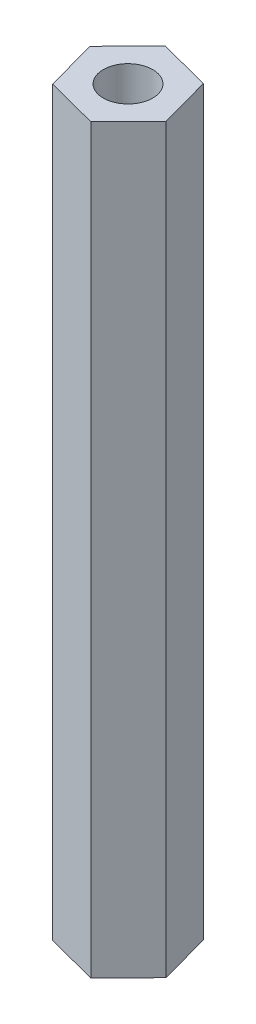
ISO-10303-21;
HEADER;
FILE_DESCRIPTION(('STEP AP214'),'2;1');
FILE_NAME('part.step','',(''),(''),'','','');
FILE_SCHEMA(('AUTOMOTIVE_DESIGN { 1 0 10303 214 1 1 1 1 }'));
ENDSEC;
DATA;
#1=APPLICATION_CONTEXT('core data for automotive mechanical design processes');
#2=APPLICATION_PROTOCOL_DEFINITION('international standard','automotive_design',2000,#1);
#3=PRODUCT_CONTEXT('',#1,'mechanical');
#4=PRODUCT('Part','Part','',(#3));
#5=PRODUCT_RELATED_PRODUCT_CATEGORY('part','',(#4));
#6=PRODUCT_DEFINITION_FORMATION('','',#4);
#7=PRODUCT_DEFINITION_CONTEXT('part definition',#1,'design');
#8=PRODUCT_DEFINITION('design','',#6,#7);
#9=PRODUCT_DEFINITION_SHAPE('','',#8);
#10=(LENGTH_UNIT() NAMED_UNIT(*) SI_UNIT(.MILLI.,.METRE.));
#11=(NAMED_UNIT(*) PLANE_ANGLE_UNIT() SI_UNIT($,.RADIAN.));
#12=(NAMED_UNIT(*) SI_UNIT($,.STERADIAN.) SOLID_ANGLE_UNIT());
#13=UNCERTAINTY_MEASURE_WITH_UNIT(LENGTH_MEASURE(1.E-05),#10,'distance_accuracy_value','');
#14=(GEOMETRIC_REPRESENTATION_CONTEXT(3) GLOBAL_UNCERTAINTY_ASSIGNED_CONTEXT((#13)) GLOBAL_UNIT_ASSIGNED_CONTEXT((#10,
#11,#12)) REPRESENTATION_CONTEXT('',''));
#15=CARTESIAN_POINT('',(0.,0.,0.));
#16=DIRECTION('',(0.,0.,1.));
#17=DIRECTION('',(1.,0.,0.));
#18=AXIS2_PLACEMENT_3D('',#15,#16,#17);
#19=CARTESIAN_POINT('',(0.,45.,0.));
#20=DIRECTION('',(0.,1.,0.));
#21=DIRECTION('',(0.,0.,1.));
#22=AXIS2_PLACEMENT_3D('',#19,#20,#21);
#23=PLANE('',#22);
#24=DIRECTION('',(0.967670500935497,0.,0.252217766264086));
#25=VECTOR('',#24,1.);
#26=CARTESIAN_POINT('',(-2.27052725330495,45.,2.30174701592786));
#27=LINE('',#26,#25);
#28=CARTESIAN_POINT('',(-2.27052725330495,45.,2.30174701592786));
#29=VERTEX_POINT('',#28);
#30=CARTESIAN_POINT('',(0.858107762226074,45.,3.11720778931092));
#31=VERTEX_POINT('',#30);
#32=EDGE_CURVE('E146',#29,#31,#27,.T.);
#33=ORIENTED_EDGE('',*,*,#32,.T.);
#34=DIRECTION('',(0.702262243338212,0.,-0.711918353170911));
#35=VECTOR('',#34,1.);
#36=CARTESIAN_POINT('',(0.858107762226074,45.,3.11720778931092));
#37=LINE('',#36,#35);
#38=CARTESIAN_POINT('',(3.12863501553103,45.,0.815460773383064));
#39=VERTEX_POINT('',#38);
#40=EDGE_CURVE('E94',#31,#39,#37,.T.);
#41=ORIENTED_EDGE('',*,*,#40,.T.);
#42=DIRECTION('',(-0.265408257597285,0.,-0.964136119434996));
#43=VECTOR('',#42,1.);
#44=CARTESIAN_POINT('',(3.12863501553103,45.,0.815460773383064));
#45=LINE('',#44,#43);
#46=CARTESIAN_POINT('',(2.27052725330495,45.,-2.30174701592786));
#47=VERTEX_POINT('',#46);
#48=EDGE_CURVE('E107',#39,#47,#45,.T.);
#49=ORIENTED_EDGE('',*,*,#48,.T.);
#50=DIRECTION('',(-0.967670500935497,0.,-0.252217766264086));
#51=VECTOR('',#50,1.);
#52=CARTESIAN_POINT('',(2.27052725330495,45.,-2.30174701592786));
#53=LINE('',#52,#51);
#54=CARTESIAN_POINT('',(-0.858107762226074,45.,-3.11720778931093));
#55=VERTEX_POINT('',#54);
#56=EDGE_CURVE('E101',#47,#55,#53,.T.);
#57=ORIENTED_EDGE('',*,*,#56,.T.);
#58=DIRECTION('',(-0.702262243338212,0.,0.711918353170911));
#59=VECTOR('',#58,1.);
#60=CARTESIAN_POINT('',(-0.858107762226074,45.,-3.11720778931093));
#61=LINE('',#60,#59);
#62=CARTESIAN_POINT('',(-3.12863501553103,45.,-0.815460773383065));
#63=VERTEX_POINT('',#62);
#64=EDGE_CURVE('E105',#55,#63,#61,.T.);
#65=ORIENTED_EDGE('',*,*,#64,.T.);
#66=DIRECTION('',(0.265408257597285,0.,0.964136119434996));
#67=VECTOR('',#66,1.);
#68=CARTESIAN_POINT('',(-3.12863501553103,45.,-0.815460773383065));
#69=LINE('',#68,#67);
#70=EDGE_CURVE('E57',#63,#29,#69,.T.);
#71=ORIENTED_EDGE('',*,*,#70,.T.);
#72=EDGE_LOOP('',(#33,#41,#49,#57,#65,#71));
#73=FACE_BOUND('',#72,.T.);
#74=CARTESIAN_POINT('',(0.,45.,0.));
#75=DIRECTION('',(0.,1.,0.));
#76=DIRECTION('',(0.,0.,1.));
#77=AXIS2_PLACEMENT_3D('',#74,#75,#76);
#78=CIRCLE('',#77,1.5);
#79=CARTESIAN_POINT('',(0.,45.,-1.5));
#80=VERTEX_POINT('',#79);
#81=EDGE_CURVE('E134',#80,#80,#78,.T.);
#82=ORIENTED_EDGE('',*,*,#81,.F.);
#83=EDGE_LOOP('',(#82));
#84=FACE_BOUND('',#83,.T.);
#85=ADVANCED_FACE('F39',(#73,#84),#23,.T.);
#86=CARTESIAN_POINT('',(0.,0.,0.));
#87=DIRECTION('',(0.,1.,0.));
#88=DIRECTION('',(0.,0.,1.));
#89=AXIS2_PLACEMENT_3D('',#86,#87,#88);
#90=PLANE('',#89);
#91=DIRECTION('',(0.967670500935497,0.,0.252217766264086));
#92=VECTOR('',#91,1.);
#93=CARTESIAN_POINT('',(-2.27052725330495,0.,2.30174701592786));
#94=LINE('',#93,#92);
#95=CARTESIAN_POINT('',(-2.27052725330495,0.,2.30174701592786));
#96=VERTEX_POINT('',#95);
#97=CARTESIAN_POINT('',(0.858107762226074,0.,3.11720778931092));
#98=VERTEX_POINT('',#97);
#99=EDGE_CURVE('E129',#96,#98,#94,.T.);
#100=ORIENTED_EDGE('',*,*,#99,.F.);
#101=DIRECTION('',(0.265408257597285,0.,0.964136119434996));
#102=VECTOR('',#101,1.);
#103=CARTESIAN_POINT('',(-3.12863501553103,0.,-0.815460773383065));
#104=LINE('',#103,#102);
#105=CARTESIAN_POINT('',(-3.12863501553103,0.,-0.815460773383065));
#106=VERTEX_POINT('',#105);
#107=EDGE_CURVE('E86',#106,#96,#104,.T.);
#108=ORIENTED_EDGE('',*,*,#107,.F.);
#109=DIRECTION('',(-0.702262243338212,0.,0.711918353170911));
#110=VECTOR('',#109,1.);
#111=CARTESIAN_POINT('',(-0.858107762226074,0.,-3.11720778931093));
#112=LINE('',#111,#110);
#113=CARTESIAN_POINT('',(-0.858107762226074,0.,-3.11720778931093));
#114=VERTEX_POINT('',#113);
#115=EDGE_CURVE('E80',#114,#106,#112,.T.);
#116=ORIENTED_EDGE('',*,*,#115,.F.);
#117=DIRECTION('',(-0.967670500935497,0.,-0.252217766264086));
#118=VECTOR('',#117,1.);
#119=CARTESIAN_POINT('',(2.27052725330495,0.,-2.30174701592786));
#120=LINE('',#119,#118);
#121=CARTESIAN_POINT('',(2.27052725330495,0.,-2.30174701592786));
#122=VERTEX_POINT('',#121);
#123=EDGE_CURVE('E116',#122,#114,#120,.T.);
#124=ORIENTED_EDGE('',*,*,#123,.F.);
#125=DIRECTION('',(-0.265408257597285,0.,-0.964136119434996));
#126=VECTOR('',#125,1.);
#127=CARTESIAN_POINT('',(3.12863501553103,0.,0.815460773383064));
#128=LINE('',#127,#126);
#129=CARTESIAN_POINT('',(3.12863501553103,0.,0.815460773383064));
#130=VERTEX_POINT('',#129);
#131=EDGE_CURVE('E137',#130,#122,#128,.T.);
#132=ORIENTED_EDGE('',*,*,#131,.F.);
#133=DIRECTION('',(0.702262243338212,0.,-0.711918353170911));
#134=VECTOR('',#133,1.);
#135=CARTESIAN_POINT('',(0.858107762226074,0.,3.11720778931092));
#136=LINE('',#135,#134);
#137=EDGE_CURVE('E133',#98,#130,#136,.T.);
#138=ORIENTED_EDGE('',*,*,#137,.F.);
#139=EDGE_LOOP('',(#100,#108,#116,#124,#132,#138));
#140=FACE_BOUND('',#139,.T.);
#141=CARTESIAN_POINT('',(0.,0.,0.));
#142=DIRECTION('',(0.,1.,0.));
#143=DIRECTION('',(0.,0.,1.));
#144=AXIS2_PLACEMENT_3D('',#141,#142,#143);
#145=CIRCLE('',#144,1.5);
#146=CARTESIAN_POINT('',(0.,0.,-1.5));
#147=VERTEX_POINT('',#146);
#148=EDGE_CURVE('E243',#147,#147,#145,.T.);
#149=ORIENTED_EDGE('',*,*,#148,.T.);
#150=EDGE_LOOP('',(#149));
#151=FACE_BOUND('',#150,.T.);
#152=ADVANCED_FACE('F159',(#140,#151),#90,.F.);
#153=CARTESIAN_POINT('',(-2.27052725330495,45.,2.30174701592786));
#154=DIRECTION('',(0.252217766264086,0.,-0.967670500935497));
#155=DIRECTION('',(-0.967670500935497,0.,-0.252217766264086));
#156=AXIS2_PLACEMENT_3D('',#153,#154,#155);
#157=PLANE('',#156);
#158=ORIENTED_EDGE('',*,*,#99,.T.);
#159=DIRECTION('',(0.,-1.,0.));
#160=VECTOR('',#159,1.);
#161=CARTESIAN_POINT('',(0.858107762226074,45.,3.11720778931092));
#162=LINE('',#161,#160);
#163=EDGE_CURVE('E11',#31,#98,#162,.T.);
#164=ORIENTED_EDGE('',*,*,#163,.F.);
#165=ORIENTED_EDGE('',*,*,#32,.F.);
#166=DIRECTION('',(0.,-1.,0.));
#167=VECTOR('',#166,1.);
#168=CARTESIAN_POINT('',(-2.27052725330495,45.,2.30174701592786));
#169=LINE('',#168,#167);
#170=EDGE_CURVE('E125',#29,#96,#169,.T.);
#171=ORIENTED_EDGE('',*,*,#170,.T.);
#172=EDGE_LOOP('',(#158,#164,#165,#171));
#173=FACE_BOUND('',#172,.T.);
#174=ADVANCED_FACE('F41',(#173),#157,.F.);
#175=CARTESIAN_POINT('',(0.858107762226074,45.,3.11720778931092));
#176=DIRECTION('',(-0.711918353170911,0.,-0.702262243338212));
#177=DIRECTION('',(-0.702262243338212,0.,0.711918353170911));
#178=AXIS2_PLACEMENT_3D('',#175,#176,#177);
#179=PLANE('',#178);
#180=ORIENTED_EDGE('',*,*,#137,.T.);
#181=DIRECTION('',(0.,-1.,0.));
#182=VECTOR('',#181,1.);
#183=CARTESIAN_POINT('',(3.12863501553103,45.,0.815460773383064));
#184=LINE('',#183,#182);
#185=EDGE_CURVE('E49',#39,#130,#184,.T.);
#186=ORIENTED_EDGE('',*,*,#185,.F.);
#187=ORIENTED_EDGE('',*,*,#40,.F.);
#188=ORIENTED_EDGE('',*,*,#163,.T.);
#189=EDGE_LOOP('',(#180,#186,#187,#188));
#190=FACE_BOUND('',#189,.T.);
#191=ADVANCED_FACE('F184',(#190),#179,.F.);
#192=CARTESIAN_POINT('',(3.12863501553103,45.,0.815460773383064));
#193=DIRECTION('',(-0.964136119434996,0.,0.265408257597285));
#194=DIRECTION('',(0.265408257597285,0.,0.964136119434996));
#195=AXIS2_PLACEMENT_3D('',#192,#193,#194);
#196=PLANE('',#195);
#197=ORIENTED_EDGE('',*,*,#131,.T.);
#198=DIRECTION('',(0.,-1.,0.));
#199=VECTOR('',#198,1.);
#200=CARTESIAN_POINT('',(2.27052725330495,45.,-2.30174701592786));
#201=LINE('',#200,#199);
#202=EDGE_CURVE('E118',#47,#122,#201,.T.);
#203=ORIENTED_EDGE('',*,*,#202,.F.);
#204=ORIENTED_EDGE('',*,*,#48,.F.);
#205=ORIENTED_EDGE('',*,*,#185,.T.);
#206=EDGE_LOOP('',(#197,#203,#204,#205));
#207=FACE_BOUND('',#206,.T.);
#208=ADVANCED_FACE('F156',(#207),#196,.F.);
#209=CARTESIAN_POINT('',(2.27052725330495,45.,-2.30174701592786));
#210=DIRECTION('',(-0.252217766264086,0.,0.967670500935497));
#211=DIRECTION('',(0.967670500935497,0.,0.252217766264086));
#212=AXIS2_PLACEMENT_3D('',#209,#210,#211);
#213=PLANE('',#212);
#214=ORIENTED_EDGE('',*,*,#123,.T.);
#215=DIRECTION('',(0.,-1.,0.));
#216=VECTOR('',#215,1.);
#217=CARTESIAN_POINT('',(-0.858107762226074,45.,-3.11720778931093));
#218=LINE('',#217,#216);
#219=EDGE_CURVE('E113',#55,#114,#218,.T.);
#220=ORIENTED_EDGE('',*,*,#219,.F.);
#221=ORIENTED_EDGE('',*,*,#56,.F.);
#222=ORIENTED_EDGE('',*,*,#202,.T.);
#223=EDGE_LOOP('',(#214,#220,#221,#222));
#224=FACE_BOUND('',#223,.T.);
#225=ADVANCED_FACE('F114',(#224),#213,.F.);
#226=CARTESIAN_POINT('',(-0.858107762226074,45.,-3.11720778931093));
#227=DIRECTION('',(0.711918353170911,0.,0.702262243338212));
#228=DIRECTION('',(0.702262243338212,0.,-0.711918353170911));
#229=AXIS2_PLACEMENT_3D('',#226,#227,#228);
#230=PLANE('',#229);
#231=ORIENTED_EDGE('',*,*,#115,.T.);
#232=DIRECTION('',(0.,-1.,0.));
#233=VECTOR('',#232,1.);
#234=CARTESIAN_POINT('',(-3.12863501553103,45.,-0.815460773383065));
#235=LINE('',#234,#233);
#236=EDGE_CURVE('E119',#63,#106,#235,.T.);
#237=ORIENTED_EDGE('',*,*,#236,.F.);
#238=ORIENTED_EDGE('',*,*,#64,.F.);
#239=ORIENTED_EDGE('',*,*,#219,.T.);
#240=EDGE_LOOP('',(#231,#237,#238,#239));
#241=FACE_BOUND('',#240,.T.);
#242=ADVANCED_FACE('F121',(#241),#230,.F.);
#243=CARTESIAN_POINT('',(-3.12863501553103,45.,-0.815460773383065));
#244=DIRECTION('',(0.964136119434996,0.,-0.265408257597285));
#245=DIRECTION('',(-0.265408257597285,0.,-0.964136119434996));
#246=AXIS2_PLACEMENT_3D('',#243,#244,#245);
#247=PLANE('',#246);
#248=ORIENTED_EDGE('',*,*,#107,.T.);
#249=ORIENTED_EDGE('',*,*,#170,.F.);
#250=ORIENTED_EDGE('',*,*,#70,.F.);
#251=ORIENTED_EDGE('',*,*,#236,.T.);
#252=EDGE_LOOP('',(#248,#249,#250,#251));
#253=FACE_BOUND('',#252,.T.);
#254=ADVANCED_FACE('F164',(#253),#247,.F.);
#255=CARTESIAN_POINT('',(0.,45.,0.));
#256=DIRECTION('',(0.,-1.,0.));
#257=DIRECTION('',(0.,0.,-1.));
#258=AXIS2_PLACEMENT_3D('',#255,#256,#257);
#259=CYLINDRICAL_SURFACE('',#258,1.5);
#260=CARTESIAN_POINT('',(0.,45.,-1.5));
#261=CARTESIAN_POINT('',(0.,44.53125,-1.5));
#262=CARTESIAN_POINT('',(0.,44.0625,-1.5));
#263=CARTESIAN_POINT('',(0.,43.125,-1.5));
#264=CARTESIAN_POINT('',(0.,42.65625,-1.5));
#265=CARTESIAN_POINT('',(0.,41.71875,-1.5));
#266=CARTESIAN_POINT('',(0.,41.25,-1.5));
#267=CARTESIAN_POINT('',(0.,40.3125,-1.5));
#268=CARTESIAN_POINT('',(0.,39.84375,-1.5));
#269=CARTESIAN_POINT('',(0.,38.90625,-1.5));
#270=CARTESIAN_POINT('',(0.,38.4375,-1.5));
#271=CARTESIAN_POINT('',(0.,37.5,-1.5));
#272=CARTESIAN_POINT('',(0.,37.03125,-1.5));
#273=CARTESIAN_POINT('',(0.,36.09375,-1.5));
#274=CARTESIAN_POINT('',(0.,35.625,-1.5));
#275=CARTESIAN_POINT('',(0.,34.6875,-1.5));
#276=CARTESIAN_POINT('',(0.,34.21875,-1.5));
#277=CARTESIAN_POINT('',(0.,33.28125,-1.5));
#278=CARTESIAN_POINT('',(0.,32.8125,-1.5));
#279=CARTESIAN_POINT('',(0.,31.875,-1.5));
#280=CARTESIAN_POINT('',(0.,31.40625,-1.5));
#281=CARTESIAN_POINT('',(0.,30.46875,-1.5));
#282=CARTESIAN_POINT('',(0.,30.,-1.5));
#283=CARTESIAN_POINT('',(0.,29.0625,-1.5));
#284=CARTESIAN_POINT('',(0.,28.59375,-1.5));
#285=CARTESIAN_POINT('',(0.,27.65625,-1.5));
#286=CARTESIAN_POINT('',(0.,27.1875,-1.5));
#287=CARTESIAN_POINT('',(0.,26.25,-1.5));
#288=CARTESIAN_POINT('',(0.,25.78125,-1.5));
#289=CARTESIAN_POINT('',(0.,24.84375,-1.5));
#290=CARTESIAN_POINT('',(0.,24.375,-1.5));
#291=CARTESIAN_POINT('',(0.,23.4375,-1.5));
#292=CARTESIAN_POINT('',(0.,22.96875,-1.5));
#293=CARTESIAN_POINT('',(0.,22.03125,-1.5));
#294=CARTESIAN_POINT('',(0.,21.5625,-1.5));
#295=CARTESIAN_POINT('',(0.,20.625,-1.5));
#296=CARTESIAN_POINT('',(0.,20.15625,-1.5));
#297=CARTESIAN_POINT('',(0.,19.21875,-1.5));
#298=CARTESIAN_POINT('',(0.,18.75,-1.5));
#299=CARTESIAN_POINT('',(0.,17.8125,-1.5));
#300=CARTESIAN_POINT('',(0.,17.34375,-1.5));
#301=CARTESIAN_POINT('',(0.,16.40625,-1.5));
#302=CARTESIAN_POINT('',(0.,15.9375,-1.5));
#303=CARTESIAN_POINT('',(0.,15.,-1.5));
#304=CARTESIAN_POINT('',(0.,14.53125,-1.5));
#305=CARTESIAN_POINT('',(0.,13.59375,-1.5));
#306=CARTESIAN_POINT('',(0.,13.125,-1.5));
#307=CARTESIAN_POINT('',(0.,12.1875,-1.5));
#308=CARTESIAN_POINT('',(0.,11.71875,-1.5));
#309=CARTESIAN_POINT('',(0.,10.78125,-1.5));
#310=CARTESIAN_POINT('',(0.,10.3125,-1.5));
#311=CARTESIAN_POINT('',(0.,9.37499999999999,-1.5));
#312=CARTESIAN_POINT('',(0.,8.90624999999999,-1.5));
#313=CARTESIAN_POINT('',(0.,7.96874999999999,-1.5));
#314=CARTESIAN_POINT('',(0.,7.5,-1.5));
#315=CARTESIAN_POINT('',(0.,6.56249999999999,-1.5));
#316=CARTESIAN_POINT('',(0.,6.09374999999999,-1.5));
#317=CARTESIAN_POINT('',(0.,5.15624999999999,-1.5));
#318=CARTESIAN_POINT('',(0.,4.68749999999999,-1.5));
#319=CARTESIAN_POINT('',(0.,3.74999999999999,-1.5));
#320=CARTESIAN_POINT('',(0.,3.28124999999999,-1.5));
#321=CARTESIAN_POINT('',(0.,2.34374999999999,-1.5));
#322=CARTESIAN_POINT('',(0.,1.87499999999999,-1.5));
#323=CARTESIAN_POINT('',(0.,0.937499999999992,-1.5));
#324=CARTESIAN_POINT('',(0.,0.468749999999993,-1.5));
#325=CARTESIAN_POINT('',(0.,0.,-1.5));
#326=B_SPLINE_CURVE_WITH_KNOTS('',3,(#260,#261,#262,#263,#264,#265,#266,#267,#268,#269,#270,
#271,#272,#273,#274,#275,#276,#277,#278,#279,#280,#281,#282,#283,#284,#285,#286,#287,#288,#289,
#290,#291,#292,#293,#294,#295,#296,#297,#298,#299,#300,#301,#302,#303,#304,#305,#306,#307,#308,
#309,#310,#311,#312,#313,#314,#315,#316,#317,#318,#319,#320,#321,#322,#323,#324,#325),
.UNSPECIFIED.,.F.,.F.,(4,2,2,2,2,2,2,2,2,2,2,2,2,2,2,2,2,2,2,2,2,2,2,2,2,2,2,2,2,2,2,2,4),(0.,
1.40625,2.8125,4.21874999999999,5.625,7.03125,8.43749999999999,9.84375,11.25,12.65625,14.0625,
15.46875,16.875,18.28125,19.6875,21.09375,22.5,23.90625,25.3125,26.71875,28.125,29.53125,
30.9375,32.34375,33.75,35.15625,36.5625,37.96875,39.375,40.78125,42.1875,43.59375,45.),.UNSPECIFIED.);
#327=EDGE_CURVE('BSEAM166',#80,#147,#326,.T.);
#328=ORIENTED_EDGE('',*,*,#81,.T.);
#329=ORIENTED_EDGE('',*,*,#148,.F.);
#330=ORIENTED_EDGE('',*,*,#327,.T.);
#331=ORIENTED_EDGE('',*,*,#327,.F.);
#332=EDGE_LOOP('',(#328,#330,#329,#331));
#333=FACE_BOUND('',#332,.T.);
#334=ADVANCED_FACE('F166',(#333),#259,.F.);
#335=CLOSED_SHELL('',(#85,#152,#174,#191,#208,#225,#242,#254,#334));
#336=MANIFOLD_SOLID_BREP('B2',#335);
#337=ADVANCED_BREP_SHAPE_REPRESENTATION('',(#18,#336),#14);
#338=SHAPE_DEFINITION_REPRESENTATION(#9,#337);
ENDSEC;
END-ISO-10303-21;
